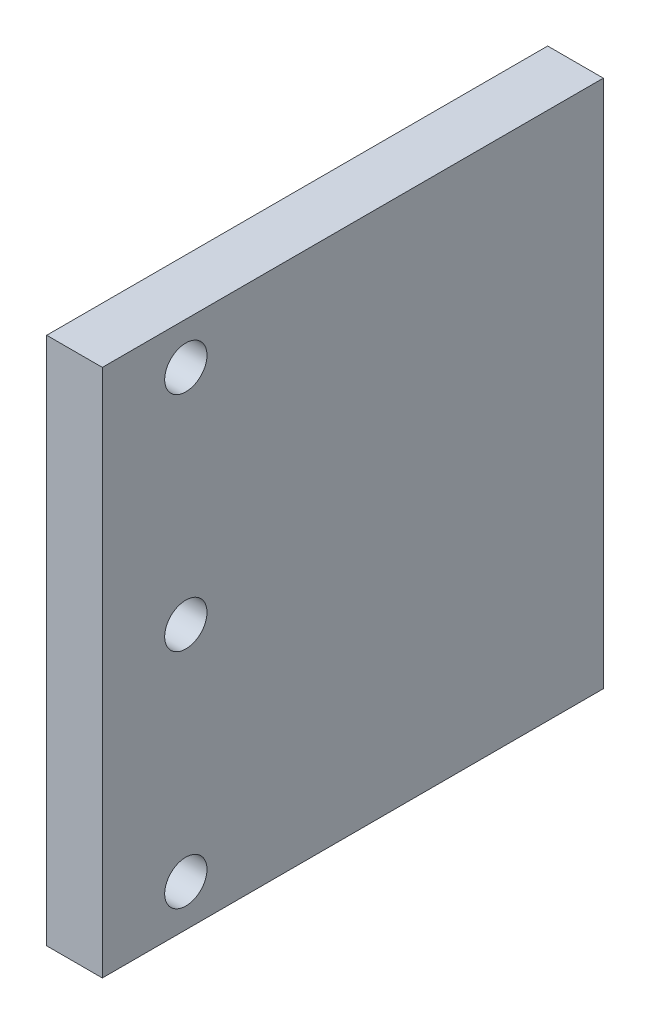
ISO-10303-21;
HEADER;
FILE_DESCRIPTION(('STEP AP214'),'2;1');
FILE_NAME('part.step','',(''),(''),'','','');
FILE_SCHEMA(('AUTOMOTIVE_DESIGN { 1 0 10303 214 1 1 1 1 }'));
ENDSEC;
DATA;
#1=APPLICATION_CONTEXT('core data for automotive mechanical design processes');
#2=APPLICATION_PROTOCOL_DEFINITION('international standard','automotive_design',2000,#1);
#3=PRODUCT_CONTEXT('',#1,'mechanical');
#4=PRODUCT('Part','Part','',(#3));
#5=PRODUCT_RELATED_PRODUCT_CATEGORY('part','',(#4));
#6=PRODUCT_DEFINITION_FORMATION('','',#4);
#7=PRODUCT_DEFINITION_CONTEXT('part definition',#1,'design');
#8=PRODUCT_DEFINITION('design','',#6,#7);
#9=PRODUCT_DEFINITION_SHAPE('','',#8);
#10=(LENGTH_UNIT() NAMED_UNIT(*) SI_UNIT(.MILLI.,.METRE.));
#11=(NAMED_UNIT(*) PLANE_ANGLE_UNIT() SI_UNIT($,.RADIAN.));
#12=(NAMED_UNIT(*) SI_UNIT($,.STERADIAN.) SOLID_ANGLE_UNIT());
#13=UNCERTAINTY_MEASURE_WITH_UNIT(LENGTH_MEASURE(1.E-05),#10,'distance_accuracy_value','');
#14=(GEOMETRIC_REPRESENTATION_CONTEXT(3) GLOBAL_UNCERTAINTY_ASSIGNED_CONTEXT((#13)) GLOBAL_UNIT_ASSIGNED_CONTEXT((#10,
#11,#12)) REPRESENTATION_CONTEXT('',''));
#15=CARTESIAN_POINT('',(0.,0.,0.));
#16=DIRECTION('',(0.,0.,1.));
#17=DIRECTION('',(1.,0.,0.));
#18=AXIS2_PLACEMENT_3D('',#15,#16,#17);
#19=CARTESIAN_POINT('',(0.,30.1625,28.575));
#20=DIRECTION('',(1.,0.,0.));
#21=DIRECTION('',(0.,0.,-1.));
#22=AXIS2_PLACEMENT_3D('',#19,#20,#21);
#23=PLANE('',#22);
#24=DIRECTION('',(0.,0.,-1.));
#25=VECTOR('',#24,1.);
#26=CARTESIAN_POINT('',(0.,30.1625,-28.575));
#27=LINE('',#26,#25);
#28=CARTESIAN_POINT('',(0.,30.1625,28.575));
#29=VERTEX_POINT('',#28);
#30=CARTESIAN_POINT('',(0.,30.1625,-28.575));
#31=VERTEX_POINT('',#30);
#32=EDGE_CURVE('E92',#29,#31,#27,.T.);
#33=ORIENTED_EDGE('',*,*,#32,.T.);
#34=DIRECTION('',(0.,1.,0.));
#35=VECTOR('',#34,1.);
#36=CARTESIAN_POINT('',(0.,-30.1625,-28.575));
#37=LINE('',#36,#35);
#38=CARTESIAN_POINT('',(0.,-30.1625,-28.575));
#39=VERTEX_POINT('',#38);
#40=EDGE_CURVE('E71',#31,#39,#37,.F.);
#41=ORIENTED_EDGE('',*,*,#40,.T.);
#42=DIRECTION('',(0.,0.,1.));
#43=VECTOR('',#42,1.);
#44=CARTESIAN_POINT('',(0.,-30.1625,-28.575));
#45=LINE('',#44,#43);
#46=CARTESIAN_POINT('',(0.,-30.1625,28.575));
#47=VERTEX_POINT('',#46);
#48=EDGE_CURVE('E54',#39,#47,#45,.T.);
#49=ORIENTED_EDGE('',*,*,#48,.T.);
#50=DIRECTION('',(0.,1.,0.));
#51=VECTOR('',#50,1.);
#52=CARTESIAN_POINT('',(0.,-30.1625,28.575));
#53=LINE('',#52,#51);
#54=EDGE_CURVE('E59',#47,#29,#53,.T.);
#55=ORIENTED_EDGE('',*,*,#54,.T.);
#56=EDGE_LOOP('',(#33,#41,#49,#55));
#57=FACE_BOUND('',#56,.T.);
#58=CARTESIAN_POINT('',(0.,0.,19.05));
#59=DIRECTION('',(1.,0.,0.));
#60=DIRECTION('',(0.,0.,-1.));
#61=AXIS2_PLACEMENT_3D('',#58,#59,#60);
#62=CIRCLE('',#61,2.413);
#63=CARTESIAN_POINT('',(0.,0.,16.637));
#64=VERTEX_POINT('',#63);
#65=EDGE_CURVE('E68',#64,#64,#62,.T.);
#66=ORIENTED_EDGE('',*,*,#65,.T.);
#67=EDGE_LOOP('',(#66));
#68=FACE_BOUND('',#67,.T.);
#69=CARTESIAN_POINT('',(0.,25.4,19.05));
#70=DIRECTION('',(1.,0.,0.));
#71=DIRECTION('',(0.,0.,-1.));
#72=AXIS2_PLACEMENT_3D('',#69,#70,#71);
#73=CIRCLE('',#72,2.413);
#74=CARTESIAN_POINT('',(0.,25.4,16.637));
#75=VERTEX_POINT('',#74);
#76=EDGE_CURVE('E94',#75,#75,#73,.T.);
#77=ORIENTED_EDGE('',*,*,#76,.T.);
#78=EDGE_LOOP('',(#77));
#79=FACE_BOUND('',#78,.T.);
#80=CARTESIAN_POINT('',(0.,-25.4,19.05));
#81=DIRECTION('',(1.,0.,0.));
#82=DIRECTION('',(0.,0.,-1.));
#83=AXIS2_PLACEMENT_3D('',#80,#81,#82);
#84=CIRCLE('',#83,2.413);
#85=CARTESIAN_POINT('',(0.,-25.4,16.637));
#86=VERTEX_POINT('',#85);
#87=EDGE_CURVE('E19',#86,#86,#84,.T.);
#88=ORIENTED_EDGE('',*,*,#87,.T.);
#89=EDGE_LOOP('',(#88));
#90=FACE_BOUND('',#89,.T.);
#91=ADVANCED_FACE('F16',(#57,#68,#79,#90),#23,.F.);
#92=CARTESIAN_POINT('',(0.,-25.4,19.05));
#93=DIRECTION('',(1.,0.,0.));
#94=DIRECTION('',(0.,0.,-1.));
#95=AXIS2_PLACEMENT_3D('',#92,#93,#94);
#96=CYLINDRICAL_SURFACE('',#95,2.413);
#97=CARTESIAN_POINT('',(6.35,-25.4,19.05));
#98=DIRECTION('',(1.,0.,0.));
#99=DIRECTION('',(0.,0.,-1.));
#100=AXIS2_PLACEMENT_3D('',#97,#98,#99);
#101=CIRCLE('',#100,2.413);
#102=CARTESIAN_POINT('',(6.35,-25.4,16.637));
#103=VERTEX_POINT('',#102);
#104=EDGE_CURVE('E89',#103,#103,#101,.F.);
#105=ORIENTED_EDGE('',*,*,#104,.F.);
#106=EDGE_LOOP('',(#105));
#107=FACE_BOUND('',#106,.T.);
#108=ORIENTED_EDGE('',*,*,#87,.F.);
#109=EDGE_LOOP('',(#108));
#110=FACE_BOUND('',#109,.T.);
#111=ADVANCED_FACE('F102',(#107,#110),#96,.F.);
#112=CARTESIAN_POINT('',(0.,25.4,19.05));
#113=DIRECTION('',(1.,0.,0.));
#114=DIRECTION('',(0.,0.,-1.));
#115=AXIS2_PLACEMENT_3D('',#112,#113,#114);
#116=CYLINDRICAL_SURFACE('',#115,2.413);
#117=CARTESIAN_POINT('',(6.35,25.4,19.05));
#118=DIRECTION('',(1.,0.,0.));
#119=DIRECTION('',(0.,0.,-1.));
#120=AXIS2_PLACEMENT_3D('',#117,#118,#119);
#121=CIRCLE('',#120,2.413);
#122=CARTESIAN_POINT('',(6.35,25.4,16.637));
#123=VERTEX_POINT('',#122);
#124=EDGE_CURVE('E86',#123,#123,#121,.F.);
#125=ORIENTED_EDGE('',*,*,#124,.F.);
#126=EDGE_LOOP('',(#125));
#127=FACE_BOUND('',#126,.T.);
#128=ORIENTED_EDGE('',*,*,#76,.F.);
#129=EDGE_LOOP('',(#128));
#130=FACE_BOUND('',#129,.T.);
#131=ADVANCED_FACE('F104',(#127,#130),#116,.F.);
#132=CARTESIAN_POINT('',(0.,0.,19.05));
#133=DIRECTION('',(1.,0.,0.));
#134=DIRECTION('',(0.,0.,-1.));
#135=AXIS2_PLACEMENT_3D('',#132,#133,#134);
#136=CYLINDRICAL_SURFACE('',#135,2.413);
#137=CARTESIAN_POINT('',(6.35,0.,19.05));
#138=DIRECTION('',(1.,0.,0.));
#139=DIRECTION('',(0.,0.,-1.));
#140=AXIS2_PLACEMENT_3D('',#137,#138,#139);
#141=CIRCLE('',#140,2.413);
#142=CARTESIAN_POINT('',(6.35,0.,16.637));
#143=VERTEX_POINT('',#142);
#144=EDGE_CURVE('E82',#143,#143,#141,.F.);
#145=ORIENTED_EDGE('',*,*,#144,.F.);
#146=EDGE_LOOP('',(#145));
#147=FACE_BOUND('',#146,.T.);
#148=ORIENTED_EDGE('',*,*,#65,.F.);
#149=EDGE_LOOP('',(#148));
#150=FACE_BOUND('',#149,.T.);
#151=ADVANCED_FACE('F111',(#147,#150),#136,.F.);
#152=CARTESIAN_POINT('',(6.35,-30.1625,28.575));
#153=DIRECTION('',(0.,0.,-1.));
#154=DIRECTION('',(-1.,0.,0.));
#155=AXIS2_PLACEMENT_3D('',#152,#153,#154);
#156=PLANE('',#155);
#157=DIRECTION('',(1.,0.,0.));
#158=VECTOR('',#157,1.);
#159=CARTESIAN_POINT('',(6.35,-30.1625,28.575));
#160=LINE('',#159,#158);
#161=CARTESIAN_POINT('',(6.35,-30.1625,28.575));
#162=VERTEX_POINT('',#161);
#163=EDGE_CURVE('E61',#47,#162,#160,.T.);
#164=ORIENTED_EDGE('',*,*,#163,.T.);
#165=DIRECTION('',(0.,1.,0.));
#166=VECTOR('',#165,1.);
#167=CARTESIAN_POINT('',(6.35,30.1625,28.575));
#168=LINE('',#167,#166);
#169=CARTESIAN_POINT('',(6.35,30.1625,28.575));
#170=VERTEX_POINT('',#169);
#171=EDGE_CURVE('E85',#170,#162,#168,.F.);
#172=ORIENTED_EDGE('',*,*,#171,.F.);
#173=DIRECTION('',(1.,0.,0.));
#174=VECTOR('',#173,1.);
#175=CARTESIAN_POINT('',(6.35,30.1625,28.575));
#176=LINE('',#175,#174);
#177=EDGE_CURVE('E64',#170,#29,#176,.F.);
#178=ORIENTED_EDGE('',*,*,#177,.T.);
#179=ORIENTED_EDGE('',*,*,#54,.F.);
#180=EDGE_LOOP('',(#164,#172,#178,#179));
#181=FACE_BOUND('',#180,.T.);
#182=ADVANCED_FACE('F60',(#181),#156,.F.);
#183=CARTESIAN_POINT('',(6.35,-30.1625,-28.575));
#184=DIRECTION('',(0.,1.,0.));
#185=DIRECTION('',(0.,0.,1.));
#186=AXIS2_PLACEMENT_3D('',#183,#184,#185);
#187=PLANE('',#186);
#188=DIRECTION('',(1.,0.,0.));
#189=VECTOR('',#188,1.);
#190=CARTESIAN_POINT('',(6.35,-30.1625,-28.575));
#191=LINE('',#190,#189);
#192=CARTESIAN_POINT('',(6.35,-30.1625,-28.575));
#193=VERTEX_POINT('',#192);
#194=EDGE_CURVE('E73',#39,#193,#191,.T.);
#195=ORIENTED_EDGE('',*,*,#194,.T.);
#196=DIRECTION('',(0.,0.,-1.));
#197=VECTOR('',#196,1.);
#198=CARTESIAN_POINT('',(6.35,-30.1625,28.575));
#199=LINE('',#198,#197);
#200=EDGE_CURVE('E77',#162,#193,#199,.T.);
#201=ORIENTED_EDGE('',*,*,#200,.F.);
#202=ORIENTED_EDGE('',*,*,#163,.F.);
#203=ORIENTED_EDGE('',*,*,#48,.F.);
#204=EDGE_LOOP('',(#195,#201,#202,#203));
#205=FACE_BOUND('',#204,.T.);
#206=ADVANCED_FACE('F75',(#205),#187,.F.);
#207=CARTESIAN_POINT('',(6.35,-30.1625,-28.575));
#208=DIRECTION('',(0.,0.,1.));
#209=DIRECTION('',(1.,0.,0.));
#210=AXIS2_PLACEMENT_3D('',#207,#208,#209);
#211=PLANE('',#210);
#212=DIRECTION('',(1.,0.,0.));
#213=VECTOR('',#212,1.);
#214=CARTESIAN_POINT('',(6.35,30.1625,-28.575));
#215=LINE('',#214,#213);
#216=CARTESIAN_POINT('',(6.35,30.1625,-28.575));
#217=VERTEX_POINT('',#216);
#218=EDGE_CURVE('E34',#31,#217,#215,.T.);
#219=ORIENTED_EDGE('',*,*,#218,.T.);
#220=DIRECTION('',(0.,1.,0.));
#221=VECTOR('',#220,1.);
#222=CARTESIAN_POINT('',(6.35,30.1625,-28.575));
#223=LINE('',#222,#221);
#224=EDGE_CURVE('E25',#193,#217,#223,.T.);
#225=ORIENTED_EDGE('',*,*,#224,.F.);
#226=ORIENTED_EDGE('',*,*,#194,.F.);
#227=ORIENTED_EDGE('',*,*,#40,.F.);
#228=EDGE_LOOP('',(#219,#225,#226,#227));
#229=FACE_BOUND('',#228,.T.);
#230=ADVANCED_FACE('F123',(#229),#211,.F.);
#231=CARTESIAN_POINT('',(6.35,30.1625,-28.575));
#232=DIRECTION('',(0.,-1.,0.));
#233=DIRECTION('',(0.,0.,-1.));
#234=AXIS2_PLACEMENT_3D('',#231,#232,#233);
#235=PLANE('',#234);
#236=ORIENTED_EDGE('',*,*,#177,.F.);
#237=DIRECTION('',(0.,0.,-1.));
#238=VECTOR('',#237,1.);
#239=CARTESIAN_POINT('',(6.35,30.1625,28.575));
#240=LINE('',#239,#238);
#241=EDGE_CURVE('E11',#217,#170,#240,.F.);
#242=ORIENTED_EDGE('',*,*,#241,.F.);
#243=ORIENTED_EDGE('',*,*,#218,.F.);
#244=ORIENTED_EDGE('',*,*,#32,.F.);
#245=EDGE_LOOP('',(#236,#242,#243,#244));
#246=FACE_BOUND('',#245,.T.);
#247=ADVANCED_FACE('F117',(#246),#235,.F.);
#248=CARTESIAN_POINT('',(6.35,30.1625,28.575));
#249=DIRECTION('',(1.,0.,0.));
#250=DIRECTION('',(0.,0.,-1.));
#251=AXIS2_PLACEMENT_3D('',#248,#249,#250);
#252=PLANE('',#251);
#253=ORIENTED_EDGE('',*,*,#224,.T.);
#254=ORIENTED_EDGE('',*,*,#241,.T.);
#255=ORIENTED_EDGE('',*,*,#171,.T.);
#256=ORIENTED_EDGE('',*,*,#200,.T.);
#257=EDGE_LOOP('',(#253,#254,#255,#256));
#258=FACE_BOUND('',#257,.T.);
#259=ORIENTED_EDGE('',*,*,#144,.T.);
#260=EDGE_LOOP('',(#259));
#261=FACE_BOUND('',#260,.T.);
#262=ORIENTED_EDGE('',*,*,#124,.T.);
#263=EDGE_LOOP('',(#262));
#264=FACE_BOUND('',#263,.T.);
#265=ORIENTED_EDGE('',*,*,#104,.T.);
#266=EDGE_LOOP('',(#265));
#267=FACE_BOUND('',#266,.T.);
#268=ADVANCED_FACE('F115',(#258,#261,#264,#267),#252,.T.);
#269=CLOSED_SHELL('',(#91,#111,#131,#151,#182,#206,#230,#247,#268));
#270=MANIFOLD_SOLID_BREP('B1',#269);
#271=ADVANCED_BREP_SHAPE_REPRESENTATION('',(#18,#270),#14);
#272=SHAPE_DEFINITION_REPRESENTATION(#9,#271);
ENDSEC;
END-ISO-10303-21;
